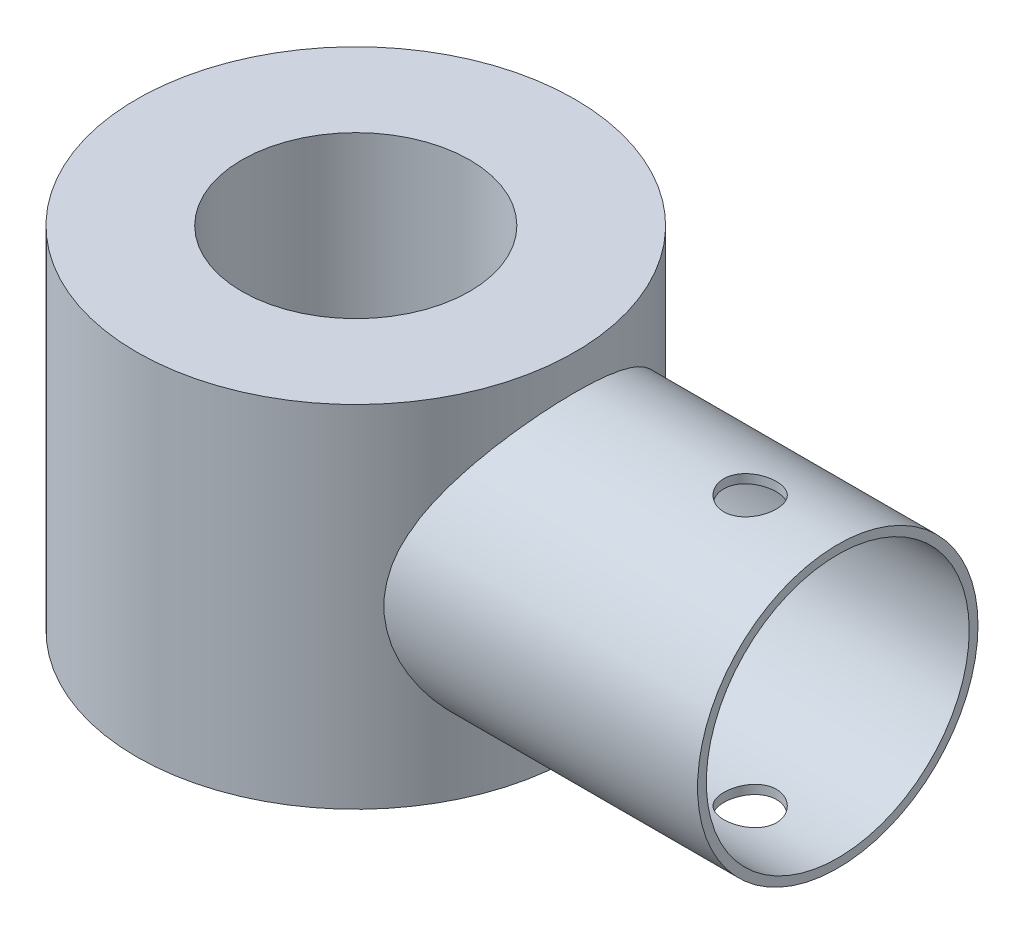
ISO-10303-21;
HEADER;
FILE_DESCRIPTION(('STEP AP214'),'2;1');
FILE_NAME('part.step','',(''),(''),'','','');
FILE_SCHEMA(('AUTOMOTIVE_DESIGN { 1 0 10303 214 1 1 1 1 }'));
ENDSEC;
DATA;
#1=APPLICATION_CONTEXT('core data for automotive mechanical design processes');
#2=APPLICATION_PROTOCOL_DEFINITION('international standard','automotive_design',2000,#1);
#3=PRODUCT_CONTEXT('',#1,'mechanical');
#4=PRODUCT('Part','Part','',(#3));
#5=PRODUCT_RELATED_PRODUCT_CATEGORY('part','',(#4));
#6=PRODUCT_DEFINITION_FORMATION('','',#4);
#7=PRODUCT_DEFINITION_CONTEXT('part definition',#1,'design');
#8=PRODUCT_DEFINITION('design','',#6,#7);
#9=PRODUCT_DEFINITION_SHAPE('','',#8);
#10=(LENGTH_UNIT() NAMED_UNIT(*) SI_UNIT(.MILLI.,.METRE.));
#11=(NAMED_UNIT(*) PLANE_ANGLE_UNIT() SI_UNIT($,.RADIAN.));
#12=(NAMED_UNIT(*) SI_UNIT($,.STERADIAN.) SOLID_ANGLE_UNIT());
#13=UNCERTAINTY_MEASURE_WITH_UNIT(LENGTH_MEASURE(1.E-05),#10,'distance_accuracy_value','');
#14=(GEOMETRIC_REPRESENTATION_CONTEXT(3) GLOBAL_UNCERTAINTY_ASSIGNED_CONTEXT((#13)) GLOBAL_UNIT_ASSIGNED_CONTEXT((#10,
#11,#12)) REPRESENTATION_CONTEXT('',''));
#15=CARTESIAN_POINT('',(0.,0.,0.));
#16=DIRECTION('',(0.,0.,1.));
#17=DIRECTION('',(1.,0.,0.));
#18=AXIS2_PLACEMENT_3D('',#15,#16,#17);
#19=CARTESIAN_POINT('',(15.,20.,0.));
#20=DIRECTION('',(1.,0.,0.));
#21=DIRECTION('',(0.,0.,-1.));
#22=AXIS2_PLACEMENT_3D('',#19,#20,#21);
#23=CYLINDRICAL_SURFACE('',#22,16.);
#24=CARTESIAN_POINT('',(45.,4.28376635449829,-3.));
#25=CARTESIAN_POINT('',(44.8330855839748,4.28376312409863,-2.99999359766589));
#26=CARTESIAN_POINT('',(44.6660881035627,4.28107840478623,-2.98602252697898));
#27=CARTESIAN_POINT('',(44.3368020768366,4.27064297972117,-2.93054506503584));
#28=CARTESIAN_POINT('',(44.1745176471452,4.26288797653816,-2.88901531536947));
#29=CARTESIAN_POINT('',(43.8594698572581,4.24322047070005,-2.77974071235582));
#30=CARTESIAN_POINT('',(43.7066977813854,4.23131184187946,-2.7120202790875));
#31=CARTESIAN_POINT('',(43.4146928814264,4.20468347358143,-2.5523513152073));
#32=CARTESIAN_POINT('',(43.2754590019934,4.18996395348773,-2.46040467518386));
#33=CARTESIAN_POINT('',(43.0127396016017,4.15916770322094,-2.25367357885245));
#34=CARTESIAN_POINT('',(42.8894470330565,4.14307766748638,-2.13864585866184));
#35=CARTESIAN_POINT('',(42.6637912208009,4.11147084671937,-1.8895435576071));
#36=CARTESIAN_POINT('',(42.5614293511504,4.09595409937696,-1.75546772724989));
#37=CARTESIAN_POINT('',(42.379801246799,4.06709964343189,-1.47080778914033));
#38=CARTESIAN_POINT('',(42.3007169329612,4.05377943895274,-1.32010568006773));
#39=CARTESIAN_POINT('',(42.1690609154529,4.0309678273414,-1.00726256650152));
#40=CARTESIAN_POINT('',(42.1164870320196,4.02147610543332,-0.84512250371901));
#41=CARTESIAN_POINT('',(42.0399409027777,4.00748489752443,-0.516005492374831));
#42=CARTESIAN_POINT('',(42.0156433881546,4.00292868047346,-0.349106646489714));
#43=CARTESIAN_POINT('',(41.9953262245992,3.99912630768812,-0.0135433520707662));
#44=CARTESIAN_POINT('',(41.9993041677219,3.99987969978606,0.15512094489534));
#45=CARTESIAN_POINT('',(42.0351755422943,4.00656732473518,0.487196715798793));
#46=CARTESIAN_POINT('',(42.06671873886,4.01243655505573,0.650647520902938));
#47=CARTESIAN_POINT('',(42.1562712987905,4.02862347332878,0.969894331430951));
#48=CARTESIAN_POINT('',(42.2142816266916,4.03894132340069,1.12569005765308));
#49=CARTESIAN_POINT('',(42.3554554621166,4.06297479405322,1.42622013150304));
#50=CARTESIAN_POINT('',(42.438758975825,4.0767092481835,1.57088714367707));
#51=CARTESIAN_POINT('',(42.6280513381543,4.10605704914301,1.84431995442928));
#52=CARTESIAN_POINT('',(42.7340424937752,4.12167058697672,1.97308413382157));
#53=CARTESIAN_POINT('',(42.9676314059671,4.15332972638867,2.21313123793807));
#54=CARTESIAN_POINT('',(43.0955355678041,4.16937828196757,2.32411581514082));
#55=CARTESIAN_POINT('',(43.3682990625572,4.19986982150759,2.52310343702521));
#56=CARTESIAN_POINT('',(43.5131586435293,4.21431278197298,2.61110614542364));
#57=CARTESIAN_POINT('',(43.8161165414053,4.23996213385757,2.76171704448955));
#58=CARTESIAN_POINT('',(43.9742369143813,4.25116298939478,2.82428187290843));
#59=CARTESIAN_POINT('',(44.2990023682464,4.26897515206622,2.92187313950112));
#60=CARTESIAN_POINT('',(44.4656464809296,4.27558697922761,2.95690269802216));
#61=CARTESIAN_POINT('',(44.8000386577118,4.28336959397989,2.99799345299478));
#62=CARTESIAN_POINT('',(44.967732231131,4.28462088367728,3.00448328571717));
#63=CARTESIAN_POINT('',(45.3018069101743,4.2817561715832,2.98945937763449));
#64=CARTESIAN_POINT('',(45.4681880802962,4.27764043522778,2.96794702172866));
#65=CARTESIAN_POINT('',(45.7935058061088,4.2645803987359,2.89789736391765));
#66=CARTESIAN_POINT('',(45.9524925052498,4.25567626618243,2.84958477167979));
#67=CARTESIAN_POINT('',(46.2601143794603,4.23407731686763,2.7275444875812));
#68=CARTESIAN_POINT('',(46.4087487906307,4.22138222073438,2.6538149225759));
#69=CARTESIAN_POINT('',(46.6933352380863,4.1934484427263,2.4820470623932));
#70=CARTESIAN_POINT('',(46.8291210757322,4.17818209149369,2.38373799279242));
#71=CARTESIAN_POINT('',(47.0824240804287,4.14690377263799,2.16596688688493));
#72=CARTESIAN_POINT('',(47.1999396031116,4.13089173807013,2.04650294866167));
#73=CARTESIAN_POINT('',(47.4149675270682,4.09966751988109,1.78789883574077));
#74=CARTESIAN_POINT('',(47.5121916532119,4.0844688833339,1.64851706819178));
#75=CARTESIAN_POINT('',(47.6818424123553,4.05681190379298,1.35514904608028));
#76=CARTESIAN_POINT('',(47.75427000005,4.04435345530549,1.20116335407706));
#77=CARTESIAN_POINT('',(47.8718401957282,4.02363884008306,0.88375508315737));
#78=CARTESIAN_POINT('',(47.9171243751228,4.0153609053972,0.720386426157979));
#79=CARTESIAN_POINT('',(47.9795740965798,4.00384715832505,0.388192454763142));
#80=CARTESIAN_POINT('',(47.9967425973254,4.00061081540117,0.219367716431698));
#81=CARTESIAN_POINT('',(48.0023706030369,3.99955544969135,-0.116181520501011));
#82=CARTESIAN_POINT('',(47.9912655062591,4.00165426749999,-0.282898614132512));
#83=CARTESIAN_POINT('',(47.9416151444631,4.01086266776532,-0.612046738558421));
#84=CARTESIAN_POINT('',(47.9030701425114,4.01797220218425,-0.774477810427463));
#85=CARTESIAN_POINT('',(47.7998175852327,4.03640324044142,-1.09021295119089));
#86=CARTESIAN_POINT('',(47.7351563742386,4.04771728037715,-1.24353263863614));
#87=CARTESIAN_POINT('',(47.5815590926891,4.07333255861592,-1.5372112626337));
#88=CARTESIAN_POINT('',(47.4926213957845,4.08763399703802,-1.67756933000769));
#89=CARTESIAN_POINT('',(47.2914970911175,4.11790440283396,-1.94351005555884));
#90=CARTESIAN_POINT('',(47.1789959322848,4.13389430829772,-2.06885247077667));
#91=CARTESIAN_POINT('',(46.9345908750064,4.16560732910015,-2.2990307213141));
#92=CARTESIAN_POINT('',(46.8026824192219,4.18133038080471,-2.40386172651201));
#93=CARTESIAN_POINT('',(46.5217470906199,4.2108884519462,-2.59095267889405));
#94=CARTESIAN_POINT('',(46.3725731207714,4.22470465612642,-2.67299481058047));
#95=CARTESIAN_POINT('',(46.0623484201479,4.24865830870154,-2.81072264841151));
#96=CARTESIAN_POINT('',(45.9013090668493,4.25879922740722,-2.86643323276462));
#97=CARTESIAN_POINT('',(45.6164954238523,4.27213967387284,-2.9385945319323));
#98=CARTESIAN_POINT('',(45.4943885524718,4.27647378556434,-2.96158211479939));
#99=CARTESIAN_POINT('',(45.2482030631637,4.28228828816693,-2.99228702152192));
#100=CARTESIAN_POINT('',(45.1241244990007,4.28376875675778,-3.00000476104182));
#101=CARTESIAN_POINT('',(45.,4.28376635449829,-3.));
#102=B_SPLINE_CURVE_WITH_KNOTS('',3,(#24,#25,#26,#27,#28,#29,#30,#31,#32,#33,#34,#35,#36,#37,
#38,#39,#40,#41,#42,#43,#44,#45,#46,#47,#48,#49,#50,#51,#52,#53,#54,#55,#56,#57,#58,#59,#60,#61,
#62,#63,#64,#65,#66,#67,#68,#69,#70,#71,#72,#73,#74,#75,#76,#77,#78,#79,#80,#81,#82,#83,#84,#85,
#86,#87,#88,#89,#90,#91,#92,#93,#94,#95,#96,#97,#98,#99,#100,#101),.UNSPECIFIED.,.T.,.F.,(4,2,2,
2,2,2,2,2,2,2,2,2,2,2,2,2,2,2,2,2,2,2,2,2,2,2,2,2,2,2,2,2,2,2,2,2,2,2,4),(0.,0.500289011586377,
1.00100260476078,1.50125045595686,2.00145927987816,2.50724671397382,3.01306734138629,
3.52274208696095,4.03237491879281,4.53608550920522,5.03975320401296,5.53711301197449,
6.03449094656849,6.53467383968438,7.03490761823571,7.54281229528128,8.050724403848,
8.55949872236533,9.06821537732975,9.56926497174151,10.0702897867744,10.5671758463074,
11.0640985324864,11.5667572530829,12.0694611878935,12.5788825099174,13.0882842164341,
13.5950053883737,14.1016732333466,14.6005860114028,15.0994940064434,15.5975205306072,
16.0955804271422,16.6007692801749,17.1060769546153,17.6160600363782,18.1255603150176,
18.4976061505795,18.8696418584437),.UNSPECIFIED.);
#103=CARTESIAN_POINT('',(45.,4.28376635449829,-3.));
#104=VERTEX_POINT('',#103);
#105=EDGE_CURVE('E84',#104,#104,#102,.T.);
#106=ORIENTED_EDGE('',*,*,#105,.T.);
#107=EDGE_LOOP('',(#106));
#108=FACE_BOUND('',#107,.T.);
#109=CARTESIAN_POINT('',(15.,20.,0.));
#110=DIRECTION('',(1.,0.,0.));
#111=DIRECTION('',(0.,0.,-1.));
#112=AXIS2_PLACEMENT_3D('',#109,#110,#111);
#113=CIRCLE('',#112,16.);
#114=CARTESIAN_POINT('',(15.,20.,-16.));
#115=VERTEX_POINT('',#114);
#116=EDGE_CURVE('E11',#115,#115,#113,.T.);
#117=ORIENTED_EDGE('',*,*,#116,.T.);
#118=EDGE_LOOP('',(#117));
#119=FACE_BOUND('',#118,.T.);
#120=CARTESIAN_POINT('',(55.,20.,0.));
#121=DIRECTION('',(1.,0.,0.));
#122=DIRECTION('',(0.,0.,-1.));
#123=AXIS2_PLACEMENT_3D('',#120,#121,#122);
#124=CIRCLE('',#123,16.);
#125=CARTESIAN_POINT('',(55.,20.,-16.));
#126=VERTEX_POINT('',#125);
#127=EDGE_CURVE('E56',#126,#126,#124,.T.);
#128=ORIENTED_EDGE('',*,*,#127,.F.);
#129=EDGE_LOOP('',(#128));
#130=FACE_BOUND('',#129,.T.);
#131=CARTESIAN_POINT('',(45.,35.7162336455017,-3.));
#132=CARTESIAN_POINT('',(45.1669144160252,35.7162368759014,-2.99999359766589));
#133=CARTESIAN_POINT('',(45.3339118964373,35.7189215952138,-2.98602252697898));
#134=CARTESIAN_POINT('',(45.6631979231633,35.7293570202788,-2.93054506503584));
#135=CARTESIAN_POINT('',(45.8254823528548,35.7371120234618,-2.88901531536947));
#136=CARTESIAN_POINT('',(46.1405301427419,35.7567795292999,-2.77974071235582));
#137=CARTESIAN_POINT('',(46.2933022186146,35.7686881581205,-2.7120202790875));
#138=CARTESIAN_POINT('',(46.5853071185736,35.7953165264186,-2.5523513152073));
#139=CARTESIAN_POINT('',(46.7245409980066,35.8100360465123,-2.46040467518386));
#140=CARTESIAN_POINT('',(46.9872603983983,35.8408322967791,-2.25367357885246));
#141=CARTESIAN_POINT('',(47.1105529669435,35.8569223325136,-2.13864585866184));
#142=CARTESIAN_POINT('',(47.3362087791991,35.8885291532806,-1.88954355760711));
#143=CARTESIAN_POINT('',(47.4385706488496,35.904045900623,-1.75546772724989));
#144=CARTESIAN_POINT('',(47.620198753201,35.9329003565681,-1.47080778914033));
#145=CARTESIAN_POINT('',(47.6992830670388,35.9462205610473,-1.32010568006773));
#146=CARTESIAN_POINT('',(47.8309390845471,35.9690321726586,-1.00726256650152));
#147=CARTESIAN_POINT('',(47.8835129679804,35.9785238945667,-0.845122503719011));
#148=CARTESIAN_POINT('',(47.9600590972223,35.9925151024756,-0.516005492374831));
#149=CARTESIAN_POINT('',(47.9843566118454,35.9970713195265,-0.349106646489714));
#150=CARTESIAN_POINT('',(48.0046737754008,36.0008736923119,-0.0135433520707668));
#151=CARTESIAN_POINT('',(48.0006958322781,36.0001203002139,0.15512094489534));
#152=CARTESIAN_POINT('',(47.9648244577057,35.9934326752648,0.487196715798792));
#153=CARTESIAN_POINT('',(47.93328126114,35.9875634449443,0.650647520902938));
#154=CARTESIAN_POINT('',(47.8437287012095,35.9713765266712,0.969894331430951));
#155=CARTESIAN_POINT('',(47.7857183733084,35.9610586765993,1.12569005765308));
#156=CARTESIAN_POINT('',(47.6445445378834,35.9370252059468,1.42622013150304));
#157=CARTESIAN_POINT('',(47.561241024175,35.9232907518165,1.57088714367707));
#158=CARTESIAN_POINT('',(47.3719486618457,35.893942950857,1.84431995442927));
#159=CARTESIAN_POINT('',(47.2659575062248,35.8783294130233,1.97308413382157));
#160=CARTESIAN_POINT('',(47.0323685940329,35.8466702736113,2.21313123793807));
#161=CARTESIAN_POINT('',(46.9044644321959,35.8306217180324,2.32411581514082));
#162=CARTESIAN_POINT('',(46.6317009374428,35.8001301784924,2.52310343702521));
#163=CARTESIAN_POINT('',(46.4868413564707,35.785687218027,2.61110614542364));
#164=CARTESIAN_POINT('',(46.1838834585947,35.7600378661424,2.76171704448955));
#165=CARTESIAN_POINT('',(46.0257630856187,35.7488370106052,2.82428187290843));
#166=CARTESIAN_POINT('',(45.7009976317536,35.7310248479338,2.92187313950112));
#167=CARTESIAN_POINT('',(45.5343535190704,35.7244130207724,2.95690269802216));
#168=CARTESIAN_POINT('',(45.1999613422882,35.7166304060201,2.99799345299478));
#169=CARTESIAN_POINT('',(45.032267768869,35.7153791163227,3.00448328571717));
#170=CARTESIAN_POINT('',(44.6981930898257,35.7182438284168,2.98945937763449));
#171=CARTESIAN_POINT('',(44.5318119197038,35.7223595647722,2.96794702172866));
#172=CARTESIAN_POINT('',(44.2064941938912,35.7354196012641,2.89789736391765));
#173=CARTESIAN_POINT('',(44.0475074947502,35.7443237338176,2.84958477167979));
#174=CARTESIAN_POINT('',(43.7398856205397,35.7659226831324,2.7275444875812));
#175=CARTESIAN_POINT('',(43.5912512093693,35.7786177792656,2.6538149225759));
#176=CARTESIAN_POINT('',(43.3066647619137,35.8065515572737,2.4820470623932));
#177=CARTESIAN_POINT('',(43.1708789242678,35.8218179085063,2.38373799279242));
#178=CARTESIAN_POINT('',(42.9175759195713,35.853096227362,2.16596688688493));
#179=CARTESIAN_POINT('',(42.8000603968884,35.8691082619299,2.04650294866167));
#180=CARTESIAN_POINT('',(42.5850324729317,35.9003324801189,1.78789883574077));
#181=CARTESIAN_POINT('',(42.4878083467881,35.9155311166661,1.64851706819178));
#182=CARTESIAN_POINT('',(42.3181575876447,35.943188096207,1.35514904608028));
#183=CARTESIAN_POINT('',(42.24572999995,35.9556465446945,1.20116335407706));
#184=CARTESIAN_POINT('',(42.1281598042718,35.9763611599169,0.883755083157372));
#185=CARTESIAN_POINT('',(42.0828756248772,35.9846390946028,0.72038642615798));
#186=CARTESIAN_POINT('',(42.0204259034202,35.9961528416749,0.388192454763143));
#187=CARTESIAN_POINT('',(42.0032574026746,35.9993891845988,0.219367716431699));
#188=CARTESIAN_POINT('',(41.9976293969631,36.0004445503087,-0.11618152050101));
#189=CARTESIAN_POINT('',(42.0087344937409,35.9983457325,-0.282898614132512));
#190=CARTESIAN_POINT('',(42.0583848555369,35.9891373322347,-0.612046738558421));
#191=CARTESIAN_POINT('',(42.0969298574886,35.9820277978158,-0.774477810427463));
#192=CARTESIAN_POINT('',(42.2001824147673,35.9635967595586,-1.09021295119089));
#193=CARTESIAN_POINT('',(42.2648436257614,35.9522827196229,-1.24353263863614));
#194=CARTESIAN_POINT('',(42.4184409073109,35.9266674413841,-1.5372112626337));
#195=CARTESIAN_POINT('',(42.5073786042155,35.912366002962,-1.67756933000769));
#196=CARTESIAN_POINT('',(42.7085029088825,35.882095597166,-1.94351005555885));
#197=CARTESIAN_POINT('',(42.8210040677152,35.8661056917023,-2.06885247077668));
#198=CARTESIAN_POINT('',(43.0654091249936,35.8343926708998,-2.2990307213141));
#199=CARTESIAN_POINT('',(43.1973175807781,35.8186696191953,-2.40386172651201));
#200=CARTESIAN_POINT('',(43.4782529093801,35.7891115480538,-2.59095267889405));
#201=CARTESIAN_POINT('',(43.6274268792286,35.7752953438736,-2.67299481058047));
#202=CARTESIAN_POINT('',(43.9376515798521,35.7513416912985,-2.81072264841151));
#203=CARTESIAN_POINT('',(44.0986909331507,35.7412007725928,-2.86643323276462));
#204=CARTESIAN_POINT('',(44.3835045761477,35.7278603261272,-2.9385945319323));
#205=CARTESIAN_POINT('',(44.5056114475282,35.7235262144357,-2.96158211479939));
#206=CARTESIAN_POINT('',(44.7517969368363,35.7177117118331,-2.99228702152192));
#207=CARTESIAN_POINT('',(44.8758755009993,35.7162312432422,-3.00000476104182));
#208=CARTESIAN_POINT('',(45.,35.7162336455017,-3.));
#209=B_SPLINE_CURVE_WITH_KNOTS('',3,(#131,#132,#133,#134,#135,#136,#137,#138,#139,#140,#141,
#142,#143,#144,#145,#146,#147,#148,#149,#150,#151,#152,#153,#154,#155,#156,#157,#158,#159,#160,
#161,#162,#163,#164,#165,#166,#167,#168,#169,#170,#171,#172,#173,#174,#175,#176,#177,#178,#179,
#180,#181,#182,#183,#184,#185,#186,#187,#188,#189,#190,#191,#192,#193,#194,#195,#196,#197,#198,
#199,#200,#201,#202,#203,#204,#205,#206,#207,#208),.UNSPECIFIED.,.T.,.F.,(4,2,2,2,2,2,2,2,2,2,2,
2,2,2,2,2,2,2,2,2,2,2,2,2,2,2,2,2,2,2,2,2,2,2,2,2,2,2,4),(0.,0.500289011586377,1.00100260476078,
1.50125045595686,2.00145927987816,2.50724671397382,3.01306734138629,3.52274208696095,
4.03237491879281,4.53608550920522,5.03975320401296,5.53711301197449,6.03449094656849,
6.53467383968438,7.0349076182357,7.54281229528128,8.050724403848,8.55949872236533,
9.06821537732975,9.5692649717415,10.0702897867744,10.5671758463074,11.0640985324864,
11.5667572530829,12.0694611878935,12.5788825099174,13.0882842164341,13.5950053883737,
14.1016732333466,14.6005860114028,15.0994940064434,15.5975205306072,16.0955804271422,
16.6007692801749,17.1060769546153,17.6160600363782,18.1255603150176,18.4976061505795,
18.8696418584437),.UNSPECIFIED.);
#210=CARTESIAN_POINT('',(45.,35.7162336455017,-3.));
#211=VERTEX_POINT('',#210);
#212=EDGE_CURVE('E89',#211,#211,#209,.T.);
#213=ORIENTED_EDGE('',*,*,#212,.T.);
#214=EDGE_LOOP('',(#213));
#215=FACE_BOUND('',#214,.T.);
#216=ADVANCED_FACE('F43',(#108,#119,#130,#215),#23,.T.);
#217=CARTESIAN_POINT('',(15.,20.,0.));
#218=DIRECTION('',(1.,0.,0.));
#219=DIRECTION('',(0.,0.,-1.));
#220=AXIS2_PLACEMENT_3D('',#217,#218,#219);
#221=CYLINDRICAL_SURFACE('',#220,15.);
#222=CARTESIAN_POINT('',(15.,20.,0.));
#223=DIRECTION('',(1.,0.,0.));
#224=DIRECTION('',(0.,0.,-1.));
#225=AXIS2_PLACEMENT_3D('',#222,#223,#224);
#226=CIRCLE('',#225,15.);
#227=CARTESIAN_POINT('',(15.,20.,-15.));
#228=VERTEX_POINT('',#227);
#229=EDGE_CURVE('E61',#228,#228,#226,.T.);
#230=ORIENTED_EDGE('',*,*,#229,.F.);
#231=EDGE_LOOP('',(#230));
#232=FACE_BOUND('',#231,.T.);
#233=CARTESIAN_POINT('',(55.,20.,0.));
#234=DIRECTION('',(1.,0.,0.));
#235=DIRECTION('',(0.,0.,-1.));
#236=AXIS2_PLACEMENT_3D('',#233,#234,#235);
#237=CIRCLE('',#236,15.);
#238=CARTESIAN_POINT('',(55.,20.,-15.));
#239=VERTEX_POINT('',#238);
#240=EDGE_CURVE('E64',#239,#239,#237,.T.);
#241=ORIENTED_EDGE('',*,*,#240,.T.);
#242=EDGE_LOOP('',(#241));
#243=FACE_BOUND('',#242,.T.);
#244=CARTESIAN_POINT('',(45.,5.30306154330093,-3.));
#245=CARTESIAN_POINT('',(44.8333068735265,5.30305822920061,-2.99999383762582));
#246=CARTESIAN_POINT('',(44.66653613,5.30019475193894,-2.98605951515443));
#247=CARTESIAN_POINT('',(44.3377124845706,5.28906706085376,-2.93073685074852));
#248=CARTESIAN_POINT('',(44.1756634660921,5.28079852565638,-2.88932654121148));
#249=CARTESIAN_POINT('',(43.8610880899374,5.25983378834437,-2.78038734785924));
#250=CARTESIAN_POINT('',(43.7085524354022,5.24714199136774,-2.71288444245786));
#251=CARTESIAN_POINT('',(43.4169754659091,5.21876601558025,-2.55374732301152));
#252=CARTESIAN_POINT('',(43.2779333983863,5.20308200379617,-2.46211445580345));
#253=CARTESIAN_POINT('',(43.0153169884384,5.17024100917242,-2.25593722696031));
#254=CARTESIAN_POINT('',(42.8919612363481,5.15306786488261,-2.14111696773996));
#255=CARTESIAN_POINT('',(42.6661273992631,5.11932583092205,-1.89242036706393));
#256=CARTESIAN_POINT('',(42.5636507777484,5.10275698367505,-1.75854269093395));
#257=CARTESIAN_POINT('',(42.3816359471146,5.07191610747314,-1.47408406777277));
#258=CARTESIAN_POINT('',(42.3023054585501,5.05766535675348,-1.32336770301663));
#259=CARTESIAN_POINT('',(42.1701751888556,5.03324789349106,-1.01041245116182));
#260=CARTESIAN_POINT('',(42.117372924297,5.02308079867642,-0.84817464426166));
#261=CARTESIAN_POINT('',(42.0404784191411,5.00809037934745,-0.519050319835483));
#262=CARTESIAN_POINT('',(42.016017067287,5.00319841135619,-0.352253217644443));
#263=CARTESIAN_POINT('',(41.9953471444851,4.99907236449189,-0.0168557053126103));
#264=CARTESIAN_POINT('',(41.9991358510625,4.99983774041723,0.151744529495528));
#265=CARTESIAN_POINT('',(42.0345785406467,5.00688695394453,0.483426002230764));
#266=CARTESIAN_POINT('',(42.0658349315035,5.01309204902485,0.646551642895408));
#267=CARTESIAN_POINT('',(42.1546950973767,5.03023468521775,0.965194879740902));
#268=CARTESIAN_POINT('',(42.2122999265756,5.04117241567883,1.12071217124139));
#269=CARTESIAN_POINT('',(42.3525901204418,5.06668111940125,1.42085838960266));
#270=CARTESIAN_POINT('',(42.4354312533147,5.0812745547433,1.5654125224017));
#271=CARTESIAN_POINT('',(42.6237272317098,5.11248591578644,1.83871513757927));
#272=CARTESIAN_POINT('',(42.7291846793116,5.12910407434333,1.967461798575));
#273=CARTESIAN_POINT('',(42.9619008663254,5.16287106906621,2.20785429316037));
#274=CARTESIAN_POINT('',(43.0895075601888,5.18002410627452,2.31916294972089));
#275=CARTESIAN_POINT('',(43.3617493273523,5.21265285203718,2.51885547953042));
#276=CARTESIAN_POINT('',(43.5063847226496,5.22812852886356,2.60723891918325));
#277=CARTESIAN_POINT('',(43.8090624954654,5.25565857581229,2.75868844440565));
#278=CARTESIAN_POINT('',(43.967132902919,5.26770555309353,2.82169994333313));
#279=CARTESIAN_POINT('',(44.291913971172,5.28690571036182,2.92017102488275));
#280=CARTESIAN_POINT('',(44.4586235028573,5.29405952814717,2.95563419836993));
#281=CARTESIAN_POINT('',(44.7928945739971,5.30253562196517,2.99749801810815));
#282=CARTESIAN_POINT('',(44.960392722931,5.30395558828537,3.00438557669374));
#283=CARTESIAN_POINT('',(45.294144669599,5.30106542933439,2.99021288493222));
#284=CARTESIAN_POINT('',(45.4603985373566,5.29675562898836,2.96915421936733));
#285=CARTESIAN_POINT('',(45.7853059208767,5.28298302515256,2.90010662422247));
#286=CARTESIAN_POINT('',(45.9440170291073,5.2735700295651,2.8523778625179));
#287=CARTESIAN_POINT('',(46.2511898370862,5.25069531945006,2.73162310592556));
#288=CARTESIAN_POINT('',(46.3996506913072,5.23723327141191,2.65859502711953));
#289=CARTESIAN_POINT('',(46.6842393298505,5.20755782113882,2.48821242664679));
#290=CARTESIAN_POINT('',(46.8201811389025,5.1913108440529,2.39055323394826));
#291=CARTESIAN_POINT('',(47.0739249360027,5.15798828520091,2.17408671663814));
#292=CARTESIAN_POINT('',(47.1917250547478,5.14091261828546,2.05527721543361));
#293=CARTESIAN_POINT('',(47.4076876775567,5.10753962392353,1.79769682049367));
#294=CARTESIAN_POINT('',(47.50552096395,5.09125826873949,1.65864749678889));
#295=CARTESIAN_POINT('',(47.6764376444988,5.0615861711414,1.36580368990427));
#296=CARTESIAN_POINT('',(47.7495220780343,5.04819530734366,1.21200982630052));
#297=CARTESIAN_POINT('',(47.8683866152399,5.02588117816801,0.894908042472039));
#298=CARTESIAN_POINT('',(47.9143215546788,5.01693262572192,0.731660020434235));
#299=CARTESIAN_POINT('',(47.9780737429915,5.00440292187015,0.399568364039734));
#300=CARTESIAN_POINT('',(47.995894378427,5.00082112400453,0.230725406133633));
#301=CARTESIAN_POINT('',(48.0027809428887,4.99944378637655,-0.104618681710866));
#302=CARTESIAN_POINT('',(47.9923418413687,5.00154864352011,-0.271109436424484));
#303=CARTESIAN_POINT('',(47.9440981483565,5.01109869318983,-0.599913093946951));
#304=CARTESIAN_POINT('',(47.9062939009556,5.01854381856706,-0.762226049261168));
#305=CARTESIAN_POINT('',(47.8046130237252,5.03793504905238,-1.07775824923519));
#306=CARTESIAN_POINT('',(47.7407958656071,5.04987088257155,-1.23099732972049));
#307=CARTESIAN_POINT('',(47.5889632760067,5.0769583362896,-1.52466366055821));
#308=CARTESIAN_POINT('',(47.5009459322865,5.09211021059036,-1.66508989730354));
#309=CARTESIAN_POINT('',(47.3015418388161,5.12427202529779,-1.93159167031775));
#310=CARTESIAN_POINT('',(47.1898009908487,5.14130799746298,-2.05739914834453));
#311=CARTESIAN_POINT('',(46.9468492797037,5.17516331276405,-2.28864785327552));
#312=CARTESIAN_POINT('',(46.8156338115602,5.19198260363843,-2.39408424962674));
#313=CARTESIAN_POINT('',(46.5357620499287,5.22369971798206,-2.58267665834995));
#314=CARTESIAN_POINT('',(46.3869331166362,5.23857489286323,-2.66558044385427));
#315=CARTESIAN_POINT('',(46.0772016802197,5.26444288620761,-2.80507214779868));
#316=CARTESIAN_POINT('',(45.9163102839384,5.27543922425048,-2.86168393792249));
#317=CARTESIAN_POINT('',(45.6292126336714,5.29010956586465,-2.93600741957297));
#318=CARTESIAN_POINT('',(45.5046437414581,5.29493645256182,-2.95996169557105));
#319=CARTESIAN_POINT('',(45.2533981363466,5.30141364622747,-2.99196005387913));
#320=CARTESIAN_POINT('',(45.1267214962666,5.30306406270746,-3.00000468468793));
#321=CARTESIAN_POINT('',(45.,5.30306154330093,-3.));
#322=B_SPLINE_CURVE_WITH_KNOTS('',3,(#244,#245,#246,#247,#248,#249,#250,#251,#252,#253,#254,
#255,#256,#257,#258,#259,#260,#261,#262,#263,#264,#265,#266,#267,#268,#269,#270,#271,#272,#273,
#274,#275,#276,#277,#278,#279,#280,#281,#282,#283,#284,#285,#286,#287,#288,#289,#290,#291,#292,
#293,#294,#295,#296,#297,#298,#299,#300,#301,#302,#303,#304,#305,#306,#307,#308,#309,#310,#311,
#312,#313,#314,#315,#316,#317,#318,#319,#320,#321),.UNSPECIFIED.,.T.,.F.,(4,2,2,2,2,2,2,2,2,2,2,
2,2,2,2,2,2,2,2,2,2,2,2,2,2,2,2,2,2,2,2,2,2,2,2,2,2,2,4),(0.,0.499615391608283,
0.999630717852891,1.49914949382176,1.99864039457959,2.5044675764531,3.01033020106266,
3.52060201312351,4.0308260473968,4.53432746649241,5.03778036348745,5.53406368900612,
6.03036687221251,6.5297977266691,7.02928607310198,7.5374804028745,8.04568434368161,
8.5549758951833,9.06420105048074,9.5647127341378,10.0651960358526,10.5608802534996,
11.056605310632,11.5587917932356,12.0610299861063,12.5709780520035,13.0809046989031,
13.5878944073595,14.0948230407488,14.5929305224406,15.0910317410027,15.5880005122636,
16.0850085640405,16.5900345607679,17.0951801666934,17.6057669573882,18.115889252706,
18.4957141091449,18.8755258705644),.UNSPECIFIED.);
#323=CARTESIAN_POINT('',(45.,5.30306154330093,-3.));
#324=VERTEX_POINT('',#323);
#325=EDGE_CURVE('E66',#324,#324,#322,.T.);
#326=ORIENTED_EDGE('',*,*,#325,.F.);
#327=EDGE_LOOP('',(#326));
#328=FACE_BOUND('',#327,.T.);
#329=CARTESIAN_POINT('',(45.,34.6969384566991,-3.));
#330=CARTESIAN_POINT('',(45.1666931264735,34.6969417707994,-2.99999383762582));
#331=CARTESIAN_POINT('',(45.33346387,34.6998052480611,-2.98605951515443));
#332=CARTESIAN_POINT('',(45.6622875154294,34.7109329391462,-2.93073685074852));
#333=CARTESIAN_POINT('',(45.8243365339079,34.7192014743436,-2.88932654121148));
#334=CARTESIAN_POINT('',(46.1389119100626,34.7401662116556,-2.78038734785924));
#335=CARTESIAN_POINT('',(46.2914475645978,34.7528580086323,-2.71288444245786));
#336=CARTESIAN_POINT('',(46.5830245340909,34.7812339844198,-2.55374732301151));
#337=CARTESIAN_POINT('',(46.7220666016137,34.7969179962038,-2.46211445580345));
#338=CARTESIAN_POINT('',(46.9846830115616,34.8297589908276,-2.25593722696031));
#339=CARTESIAN_POINT('',(47.1080387636519,34.8469321351174,-2.14111696773996));
#340=CARTESIAN_POINT('',(47.3338726007369,34.880674169078,-1.89242036706393));
#341=CARTESIAN_POINT('',(47.4363492222516,34.8972430163249,-1.75854269093395));
#342=CARTESIAN_POINT('',(47.6183640528854,34.9280838925269,-1.47408406777277));
#343=CARTESIAN_POINT('',(47.6976945414499,34.9423346432465,-1.32336770301663));
#344=CARTESIAN_POINT('',(47.8298248111444,34.9667521065089,-1.01041245116181));
#345=CARTESIAN_POINT('',(47.882627075703,34.9769192013236,-0.848174644261659));
#346=CARTESIAN_POINT('',(47.9595215808589,34.9919096206525,-0.519050319835483));
#347=CARTESIAN_POINT('',(47.983982932713,34.9968015886438,-0.352253217644442));
#348=CARTESIAN_POINT('',(48.0046528555149,35.0009276355081,-0.0168557053126095));
#349=CARTESIAN_POINT('',(48.0008641489375,35.0001622595828,0.151744529495529));
#350=CARTESIAN_POINT('',(47.9654214593533,34.9931130460555,0.483426002230765));
#351=CARTESIAN_POINT('',(47.9341650684965,34.9869079509752,0.646551642895409));
#352=CARTESIAN_POINT('',(47.8453049026233,34.9697653147823,0.965194879740903));
#353=CARTESIAN_POINT('',(47.7877000734244,34.9588275843212,1.12071217124139));
#354=CARTESIAN_POINT('',(47.6474098795582,34.9333188805988,1.42085838960266));
#355=CARTESIAN_POINT('',(47.5645687466853,34.9187254452567,1.5654125224017));
#356=CARTESIAN_POINT('',(47.3762727682902,34.8875140842136,1.83871513757927));
#357=CARTESIAN_POINT('',(47.2708153206884,34.8708959256567,1.967461798575));
#358=CARTESIAN_POINT('',(47.0380991336746,34.8371289309338,2.20785429316037));
#359=CARTESIAN_POINT('',(46.9104924398112,34.8199758937255,2.31916294972089));
#360=CARTESIAN_POINT('',(46.6382506726477,34.7873471479628,2.51885547953042));
#361=CARTESIAN_POINT('',(46.4936152773504,34.7718714711364,2.60723891918325));
#362=CARTESIAN_POINT('',(46.1909375045346,34.7443414241877,2.75868844440565));
#363=CARTESIAN_POINT('',(46.032867097081,34.7322944469065,2.82169994333313));
#364=CARTESIAN_POINT('',(45.708086028828,34.7130942896382,2.92017102488275));
#365=CARTESIAN_POINT('',(45.5413764971427,34.7059404718528,2.95563419836993));
#366=CARTESIAN_POINT('',(45.2071054260029,34.6974643780348,2.99749801810815));
#367=CARTESIAN_POINT('',(45.039607277069,34.6960444117146,3.00438557669374));
#368=CARTESIAN_POINT('',(44.705855330401,34.6989345706656,2.99021288493222));
#369=CARTESIAN_POINT('',(44.5396014626434,34.7032443710116,2.96915421936733));
#370=CARTESIAN_POINT('',(44.2146940791233,34.7170169748474,2.90010662422247));
#371=CARTESIAN_POINT('',(44.0559829708927,34.7264299704349,2.8523778625179));
#372=CARTESIAN_POINT('',(43.7488101629138,34.7493046805499,2.73162310592555));
#373=CARTESIAN_POINT('',(43.6003493086928,34.7627667285881,2.65859502711953));
#374=CARTESIAN_POINT('',(43.3157606701495,34.7924421788612,2.48821242664679));
#375=CARTESIAN_POINT('',(43.1798188610975,34.8086891559471,2.39055323394826));
#376=CARTESIAN_POINT('',(42.9260750639973,34.8420117147991,2.17408671663814));
#377=CARTESIAN_POINT('',(42.8082749452522,34.8590873817145,2.05527721543361));
#378=CARTESIAN_POINT('',(42.5923123224433,34.8924603760765,1.79769682049367));
#379=CARTESIAN_POINT('',(42.49447903605,34.9087417312605,1.65864749678889));
#380=CARTESIAN_POINT('',(42.3235623555012,34.9384138288586,1.36580368990427));
#381=CARTESIAN_POINT('',(42.2504779219657,34.9518046926563,1.21200982630052));
#382=CARTESIAN_POINT('',(42.1316133847601,34.974118821832,0.894908042472039));
#383=CARTESIAN_POINT('',(42.0856784453212,34.9830673742781,0.731660020434236));
#384=CARTESIAN_POINT('',(42.0219262570085,34.9955970781298,0.399568364039737));
#385=CARTESIAN_POINT('',(42.004105621573,34.9991788759955,0.230725406133637));
#386=CARTESIAN_POINT('',(41.9972190571113,35.0005562136234,-0.104618681710862));
#387=CARTESIAN_POINT('',(42.0076581586313,34.9984513564799,-0.27110943642448));
#388=CARTESIAN_POINT('',(42.0559018516435,34.9889013068102,-0.599913093946948));
#389=CARTESIAN_POINT('',(42.0937060990444,34.9814561814329,-0.762226049261165));
#390=CARTESIAN_POINT('',(42.1953869762748,34.9620649509476,-1.07775824923519));
#391=CARTESIAN_POINT('',(42.2592041343929,34.9501291174284,-1.23099732972049));
#392=CARTESIAN_POINT('',(42.4110367239933,34.9230416637104,-1.52466366055821));
#393=CARTESIAN_POINT('',(42.4990540677135,34.9078897894096,-1.66508989730354));
#394=CARTESIAN_POINT('',(42.6984581611839,34.8757279747022,-1.93159167031775));
#395=CARTESIAN_POINT('',(42.8101990091513,34.858692002537,-2.05739914834453));
#396=CARTESIAN_POINT('',(43.0531507202963,34.824836687236,-2.28864785327552));
#397=CARTESIAN_POINT('',(43.1843661884398,34.8080173963616,-2.39408424962675));
#398=CARTESIAN_POINT('',(43.4642379500713,34.7763002820179,-2.58267665834995));
#399=CARTESIAN_POINT('',(43.6130668833638,34.7614251071368,-2.66558044385427));
#400=CARTESIAN_POINT('',(43.9227983197803,34.7355571137924,-2.80507214779868));
#401=CARTESIAN_POINT('',(44.0836897160616,34.7245607757495,-2.86168393792249));
#402=CARTESIAN_POINT('',(44.3707873663286,34.7098904341354,-2.93600741957297));
#403=CARTESIAN_POINT('',(44.4953562585419,34.7050635474382,-2.95996169557105));
#404=CARTESIAN_POINT('',(44.7466018636534,34.6985863537725,-2.99196005387913));
#405=CARTESIAN_POINT('',(44.8732785037334,34.6969359372925,-3.00000468468793));
#406=CARTESIAN_POINT('',(45.,34.6969384566991,-3.));
#407=B_SPLINE_CURVE_WITH_KNOTS('',3,(#329,#330,#331,#332,#333,#334,#335,#336,#337,#338,#339,
#340,#341,#342,#343,#344,#345,#346,#347,#348,#349,#350,#351,#352,#353,#354,#355,#356,#357,#358,
#359,#360,#361,#362,#363,#364,#365,#366,#367,#368,#369,#370,#371,#372,#373,#374,#375,#376,#377,
#378,#379,#380,#381,#382,#383,#384,#385,#386,#387,#388,#389,#390,#391,#392,#393,#394,#395,#396,
#397,#398,#399,#400,#401,#402,#403,#404,#405,#406),.UNSPECIFIED.,.T.,.F.,(4,2,2,2,2,2,2,2,2,2,2,
2,2,2,2,2,2,2,2,2,2,2,2,2,2,2,2,2,2,2,2,2,2,2,2,2,2,2,4),(0.,0.499615391608283,
0.999630717852891,1.49914949382176,1.99864039457959,2.5044675764531,3.01033020106266,
3.52060201312351,4.03082604739679,4.53432746649241,5.03778036348745,5.53406368900612,
6.03036687221251,6.5297977266691,7.02928607310198,7.5374804028745,8.04568434368161,
8.5549758951833,9.06420105048074,9.5647127341378,10.0651960358526,10.5608802534996,
11.056605310632,11.5587917932356,12.0610299861063,12.5709780520035,13.0809046989031,
13.5878944073595,14.0948230407488,14.5929305224406,15.0910317410027,15.5880005122636,
16.0850085640405,16.5900345607679,17.0951801666934,17.6057669573882,18.1158892527059,
18.4957141091448,18.8755258705644),.UNSPECIFIED.);
#408=CARTESIAN_POINT('',(45.,34.6969384566991,-3.));
#409=VERTEX_POINT('',#408);
#410=EDGE_CURVE('E47',#409,#409,#407,.T.);
#411=ORIENTED_EDGE('',*,*,#410,.F.);
#412=EDGE_LOOP('',(#411));
#413=FACE_BOUND('',#412,.T.);
#414=ADVANCED_FACE('F71',(#232,#243,#328,#413),#221,.F.);
#415=CARTESIAN_POINT('',(15.,20.,0.));
#416=DIRECTION('',(1.,0.,0.));
#417=DIRECTION('',(0.,0.,-1.));
#418=AXIS2_PLACEMENT_3D('',#415,#416,#417);
#419=PLANE('',#418);
#420=ORIENTED_EDGE('',*,*,#229,.T.);
#421=EDGE_LOOP('',(#420));
#422=FACE_BOUND('',#421,.T.);
#423=ORIENTED_EDGE('',*,*,#116,.F.);
#424=EDGE_LOOP('',(#423));
#425=FACE_BOUND('',#424,.T.);
#426=ADVANCED_FACE('F105',(#422,#425),#419,.F.);
#427=CARTESIAN_POINT('',(55.,20.,0.));
#428=DIRECTION('',(1.,0.,0.));
#429=DIRECTION('',(0.,0.,-1.));
#430=AXIS2_PLACEMENT_3D('',#427,#428,#429);
#431=PLANE('',#430);
#432=ORIENTED_EDGE('',*,*,#240,.F.);
#433=EDGE_LOOP('',(#432));
#434=FACE_BOUND('',#433,.T.);
#435=ORIENTED_EDGE('',*,*,#127,.T.);
#436=EDGE_LOOP('',(#435));
#437=FACE_BOUND('',#436,.T.);
#438=ADVANCED_FACE('F102',(#434,#437),#431,.T.);
#439=CARTESIAN_POINT('',(45.,39.,0.));
#440=DIRECTION('',(0.,-1.,0.));
#441=DIRECTION('',(0.,0.,-1.));
#442=AXIS2_PLACEMENT_3D('',#439,#440,#441);
#443=CYLINDRICAL_SURFACE('',#442,3.);
#444=ORIENTED_EDGE('',*,*,#105,.F.);
#445=EDGE_LOOP('',(#444));
#446=FACE_BOUND('',#445,.T.);
#447=ORIENTED_EDGE('',*,*,#325,.T.);
#448=EDGE_LOOP('',(#447));
#449=FACE_BOUND('',#448,.T.);
#450=ADVANCED_FACE('F77',(#446,#449),#443,.F.);
#451=ORIENTED_EDGE('',*,*,#212,.F.);
#452=EDGE_LOOP('',(#451));
#453=FACE_BOUND('',#452,.T.);
#454=ORIENTED_EDGE('',*,*,#410,.T.);
#455=EDGE_LOOP('',(#454));
#456=FACE_BOUND('',#455,.T.);
#457=ADVANCED_FACE('F74',(#453,#456),#443,.F.);
#458=CLOSED_SHELL('',(#216,#414,#426,#438,#450,#457));
#459=MANIFOLD_SOLID_BREP('B2',#458);
#460=CARTESIAN_POINT('',(0.,40.,0.));
#461=DIRECTION('',(0.,1.,0.));
#462=DIRECTION('',(0.,0.,1.));
#463=AXIS2_PLACEMENT_3D('',#460,#461,#462);
#464=PLANE('',#463);
#465=CARTESIAN_POINT('',(0.,40.,0.));
#466=DIRECTION('',(0.,1.,0.));
#467=DIRECTION('',(0.,0.,1.));
#468=AXIS2_PLACEMENT_3D('',#465,#466,#467);
#469=CIRCLE('',#468,25.);
#470=CARTESIAN_POINT('',(0.,40.,25.));
#471=VERTEX_POINT('',#470);
#472=EDGE_CURVE('E42',#471,#471,#469,.T.);
#473=ORIENTED_EDGE('',*,*,#472,.T.);
#474=EDGE_LOOP('',(#473));
#475=FACE_BOUND('',#474,.T.);
#476=CARTESIAN_POINT('',(0.,40.,0.));
#477=DIRECTION('',(0.,1.,0.));
#478=DIRECTION('',(0.,0.,1.));
#479=AXIS2_PLACEMENT_3D('',#476,#477,#478);
#480=CIRCLE('',#479,13.);
#481=CARTESIAN_POINT('',(0.,40.,13.));
#482=VERTEX_POINT('',#481);
#483=EDGE_CURVE('E177',#482,#482,#480,.T.);
#484=ORIENTED_EDGE('',*,*,#483,.F.);
#485=EDGE_LOOP('',(#484));
#486=FACE_BOUND('',#485,.T.);
#487=ADVANCED_FACE('F166',(#475,#486),#464,.T.);
#488=CARTESIAN_POINT('',(0.,0.,0.));
#489=DIRECTION('',(0.,1.,0.));
#490=DIRECTION('',(0.,0.,1.));
#491=AXIS2_PLACEMENT_3D('',#488,#489,#490);
#492=PLANE('',#491);
#493=CARTESIAN_POINT('',(0.,0.,0.));
#494=DIRECTION('',(0.,1.,0.));
#495=DIRECTION('',(0.,0.,1.));
#496=AXIS2_PLACEMENT_3D('',#493,#494,#495);
#497=CIRCLE('',#496,25.);
#498=CARTESIAN_POINT('',(0.,0.,25.));
#499=VERTEX_POINT('',#498);
#500=EDGE_CURVE('E170',#499,#499,#497,.T.);
#501=ORIENTED_EDGE('',*,*,#500,.F.);
#502=EDGE_LOOP('',(#501));
#503=FACE_BOUND('',#502,.T.);
#504=CARTESIAN_POINT('',(0.,0.,0.));
#505=DIRECTION('',(0.,1.,0.));
#506=DIRECTION('',(0.,0.,1.));
#507=AXIS2_PLACEMENT_3D('',#504,#505,#506);
#508=CIRCLE('',#507,13.);
#509=CARTESIAN_POINT('',(0.,0.,13.));
#510=VERTEX_POINT('',#509);
#511=EDGE_CURVE('E179',#510,#510,#508,.T.);
#512=ORIENTED_EDGE('',*,*,#511,.T.);
#513=EDGE_LOOP('',(#512));
#514=FACE_BOUND('',#513,.T.);
#515=ADVANCED_FACE('F189',(#503,#514),#492,.F.);
#516=CARTESIAN_POINT('',(0.,40.,0.));
#517=DIRECTION('',(0.,-1.,0.));
#518=DIRECTION('',(0.,0.,-1.));
#519=AXIS2_PLACEMENT_3D('',#516,#517,#518);
#520=CYLINDRICAL_SURFACE('',#519,25.);
#521=ORIENTED_EDGE('',*,*,#472,.F.);
#522=EDGE_LOOP('',(#521));
#523=FACE_BOUND('',#522,.T.);
#524=ORIENTED_EDGE('',*,*,#500,.T.);
#525=EDGE_LOOP('',(#524));
#526=FACE_BOUND('',#525,.T.);
#527=ADVANCED_FACE('F168',(#523,#526),#520,.T.);
#528=CARTESIAN_POINT('',(0.,40.,0.));
#529=DIRECTION('',(0.,-1.,0.));
#530=DIRECTION('',(0.,0.,-1.));
#531=AXIS2_PLACEMENT_3D('',#528,#529,#530);
#532=CYLINDRICAL_SURFACE('',#531,13.);
#533=ORIENTED_EDGE('',*,*,#483,.T.);
#534=EDGE_LOOP('',(#533));
#535=FACE_BOUND('',#534,.T.);
#536=ORIENTED_EDGE('',*,*,#511,.F.);
#537=EDGE_LOOP('',(#536));
#538=FACE_BOUND('',#537,.T.);
#539=ADVANCED_FACE('F185',(#535,#538),#532,.F.);
#540=CLOSED_SHELL('',(#487,#515,#527,#539));
#541=MANIFOLD_SOLID_BREP('B6',#540);
#542=ADVANCED_BREP_SHAPE_REPRESENTATION('',(#18,#459,#541),#14);
#543=SHAPE_DEFINITION_REPRESENTATION(#9,#542);
ENDSEC;
END-ISO-10303-21;
